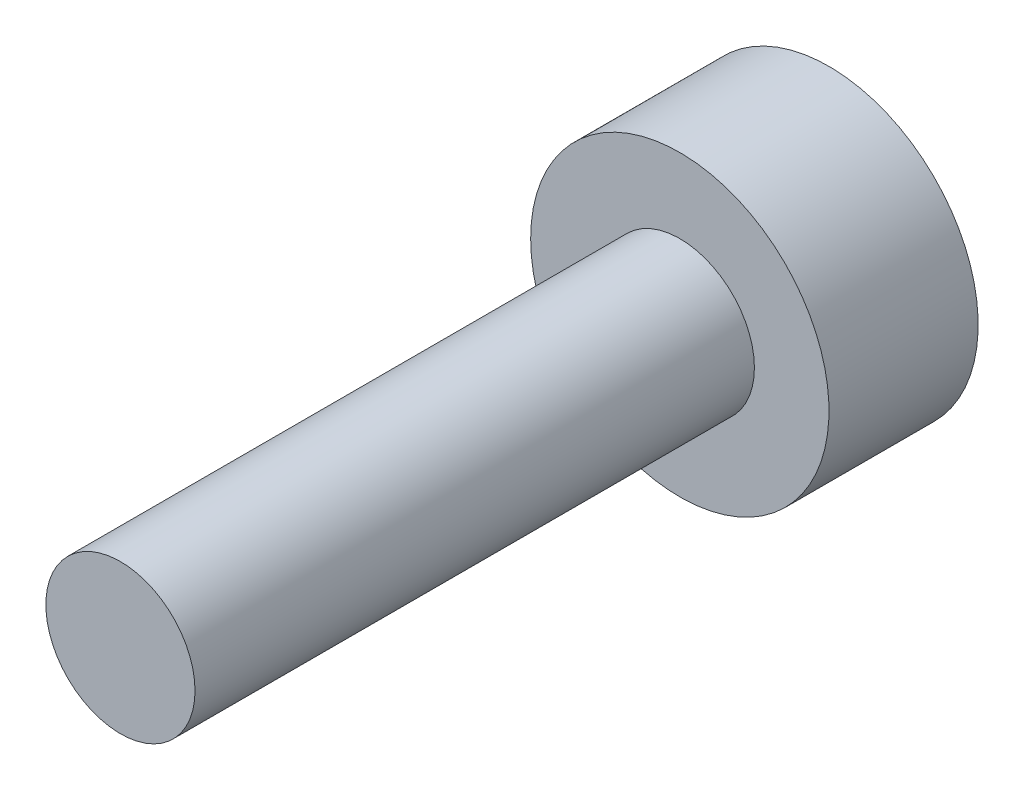
ISO-10303-21;
HEADER;
FILE_DESCRIPTION(('STEP AP214'),'2;1');
FILE_NAME('part.step','',(''),(''),'','','');
FILE_SCHEMA(('AUTOMOTIVE_DESIGN { 1 0 10303 214 1 1 1 1 }'));
ENDSEC;
DATA;
#1=APPLICATION_CONTEXT('core data for automotive mechanical design processes');
#2=APPLICATION_PROTOCOL_DEFINITION('international standard','automotive_design',2000,#1);
#3=PRODUCT_CONTEXT('',#1,'mechanical');
#4=PRODUCT('Part','Part','',(#3));
#5=PRODUCT_RELATED_PRODUCT_CATEGORY('part','',(#4));
#6=PRODUCT_DEFINITION_FORMATION('','',#4);
#7=PRODUCT_DEFINITION_CONTEXT('part definition',#1,'design');
#8=PRODUCT_DEFINITION('design','',#6,#7);
#9=PRODUCT_DEFINITION_SHAPE('','',#8);
#10=(LENGTH_UNIT() NAMED_UNIT(*) SI_UNIT(.MILLI.,.METRE.));
#11=(NAMED_UNIT(*) PLANE_ANGLE_UNIT() SI_UNIT($,.RADIAN.));
#12=(NAMED_UNIT(*) SI_UNIT($,.STERADIAN.) SOLID_ANGLE_UNIT());
#13=UNCERTAINTY_MEASURE_WITH_UNIT(LENGTH_MEASURE(1.E-05),#10,'distance_accuracy_value','');
#14=(GEOMETRIC_REPRESENTATION_CONTEXT(3) GLOBAL_UNCERTAINTY_ASSIGNED_CONTEXT((#13)) GLOBAL_UNIT_ASSIGNED_CONTEXT((#10,
#11,#12)) REPRESENTATION_CONTEXT('',''));
#15=CARTESIAN_POINT('',(0.,0.,0.));
#16=DIRECTION('',(0.,0.,1.));
#17=DIRECTION('',(1.,0.,0.));
#18=AXIS2_PLACEMENT_3D('',#15,#16,#17);
#19=CARTESIAN_POINT('',(0.,0.,6.));
#20=DIRECTION('',(0.,0.,-1.));
#21=DIRECTION('',(-1.,0.,0.));
#22=AXIS2_PLACEMENT_3D('',#19,#20,#21);
#23=CYLINDRICAL_SURFACE('',#22,0.799999999999999);
#24=CARTESIAN_POINT('',(0.,0.,6.));
#25=DIRECTION('',(0.,0.,1.));
#26=DIRECTION('',(1.,0.,0.));
#27=AXIS2_PLACEMENT_3D('',#24,#25,#26);
#28=CIRCLE('',#27,0.799999999999999);
#29=CARTESIAN_POINT('',(0.799999999999999,0.,6.));
#30=VERTEX_POINT('',#29);
#31=EDGE_CURVE('E11',#30,#30,#28,.T.);
#32=ORIENTED_EDGE('',*,*,#31,.F.);
#33=EDGE_LOOP('',(#32));
#34=FACE_BOUND('',#33,.T.);
#35=CARTESIAN_POINT('',(0.,0.,0.));
#36=DIRECTION('',(0.,0.,1.));
#37=DIRECTION('',(1.,0.,0.));
#38=AXIS2_PLACEMENT_3D('',#35,#36,#37);
#39=CIRCLE('',#38,0.799999999999999);
#40=CARTESIAN_POINT('',(0.799999999999999,0.,0.));
#41=VERTEX_POINT('',#40);
#42=EDGE_CURVE('E35',#41,#41,#39,.T.);
#43=ORIENTED_EDGE('',*,*,#42,.T.);
#44=EDGE_LOOP('',(#43));
#45=FACE_BOUND('',#44,.T.);
#46=ADVANCED_FACE('F32',(#34,#45),#23,.T.);
#47=CARTESIAN_POINT('',(0.,0.,6.));
#48=DIRECTION('',(0.,0.,1.));
#49=DIRECTION('',(1.,0.,0.));
#50=AXIS2_PLACEMENT_3D('',#47,#48,#49);
#51=PLANE('',#50);
#52=ORIENTED_EDGE('',*,*,#31,.T.);
#53=EDGE_LOOP('',(#52));
#54=FACE_BOUND('',#53,.T.);
#55=ADVANCED_FACE('F164',(#54),#51,.T.);
#56=CARTESIAN_POINT('',(0.,0.,-1.6));
#57=DIRECTION('',(0.,0.,1.));
#58=DIRECTION('',(1.,0.,0.));
#59=AXIS2_PLACEMENT_3D('',#56,#57,#58);
#60=CYLINDRICAL_SURFACE('',#59,1.6);
#61=CARTESIAN_POINT('',(0.,0.,-1.6));
#62=DIRECTION('',(0.,0.,-1.));
#63=DIRECTION('',(-1.,0.,0.));
#64=AXIS2_PLACEMENT_3D('',#61,#62,#63);
#65=CIRCLE('',#64,1.6);
#66=CARTESIAN_POINT('',(-1.6,0.,-1.6));
#67=VERTEX_POINT('',#66);
#68=EDGE_CURVE('E139',#67,#67,#65,.T.);
#69=ORIENTED_EDGE('',*,*,#68,.F.);
#70=EDGE_LOOP('',(#69));
#71=FACE_BOUND('',#70,.T.);
#72=CARTESIAN_POINT('',(0.,0.,0.));
#73=DIRECTION('',(0.,0.,-1.));
#74=DIRECTION('',(-1.,0.,0.));
#75=AXIS2_PLACEMENT_3D('',#72,#73,#74);
#76=CIRCLE('',#75,1.6);
#77=CARTESIAN_POINT('',(-1.6,0.,0.));
#78=VERTEX_POINT('',#77);
#79=EDGE_CURVE('E133',#78,#78,#76,.T.);
#80=ORIENTED_EDGE('',*,*,#79,.T.);
#81=EDGE_LOOP('',(#80));
#82=FACE_BOUND('',#81,.T.);
#83=ADVANCED_FACE('F145',(#71,#82),#60,.T.);
#84=CARTESIAN_POINT('',(0.,0.,-1.6));
#85=DIRECTION('',(0.,0.,-1.));
#86=DIRECTION('',(-1.,0.,0.));
#87=AXIS2_PLACEMENT_3D('',#84,#85,#86);
#88=PLANE('',#87);
#89=DIRECTION('',(-0.5,0.866025403784439,0.));
#90=VECTOR('',#89,1.);
#91=CARTESIAN_POINT('',(-0.4,-0.692820323027551,-1.6));
#92=LINE('',#91,#90);
#93=CARTESIAN_POINT('',(-0.4,-0.692820323027551,-1.6));
#94=VERTEX_POINT('',#93);
#95=CARTESIAN_POINT('',(-0.8,0.,-1.6));
#96=VERTEX_POINT('',#95);
#97=EDGE_CURVE('E46',#94,#96,#92,.T.);
#98=ORIENTED_EDGE('',*,*,#97,.F.);
#99=DIRECTION('',(-1.,0.,0.));
#100=VECTOR('',#99,1.);
#101=CARTESIAN_POINT('',(0.4,-0.692820323027551,-1.6));
#102=LINE('',#101,#100);
#103=CARTESIAN_POINT('',(0.4,-0.692820323027551,-1.6));
#104=VERTEX_POINT('',#103);
#105=EDGE_CURVE('E129',#104,#94,#102,.T.);
#106=ORIENTED_EDGE('',*,*,#105,.F.);
#107=DIRECTION('',(-0.5,-0.866025403784439,0.));
#108=VECTOR('',#107,1.);
#109=CARTESIAN_POINT('',(0.8,0.,-1.6));
#110=LINE('',#109,#108);
#111=CARTESIAN_POINT('',(0.8,0.,-1.6));
#112=VERTEX_POINT('',#111);
#113=EDGE_CURVE('E127',#112,#104,#110,.T.);
#114=ORIENTED_EDGE('',*,*,#113,.F.);
#115=DIRECTION('',(0.5,-0.866025403784439,0.));
#116=VECTOR('',#115,1.);
#117=CARTESIAN_POINT('',(0.4,0.692820323027551,-1.6));
#118=LINE('',#117,#116);
#119=CARTESIAN_POINT('',(0.4,0.692820323027551,-1.6));
#120=VERTEX_POINT('',#119);
#121=EDGE_CURVE('E94',#120,#112,#118,.T.);
#122=ORIENTED_EDGE('',*,*,#121,.F.);
#123=DIRECTION('',(1.,0.,0.));
#124=VECTOR('',#123,1.);
#125=CARTESIAN_POINT('',(-0.4,0.692820323027551,-1.6));
#126=LINE('',#125,#124);
#127=CARTESIAN_POINT('',(-0.4,0.692820323027551,-1.6));
#128=VERTEX_POINT('',#127);
#129=EDGE_CURVE('E123',#128,#120,#126,.T.);
#130=ORIENTED_EDGE('',*,*,#129,.F.);
#131=DIRECTION('',(0.5,0.866025403784439,0.));
#132=VECTOR('',#131,1.);
#133=CARTESIAN_POINT('',(-0.8,0.,-1.6));
#134=LINE('',#133,#132);
#135=EDGE_CURVE('E120',#96,#128,#134,.T.);
#136=ORIENTED_EDGE('',*,*,#135,.F.);
#137=EDGE_LOOP('',(#98,#106,#114,#122,#130,#136));
#138=FACE_BOUND('',#137,.T.);
#139=ORIENTED_EDGE('',*,*,#68,.T.);
#140=EDGE_LOOP('',(#139));
#141=FACE_BOUND('',#140,.T.);
#142=ADVANCED_FACE('F150',(#138,#141),#88,.T.);
#143=CARTESIAN_POINT('',(0.,0.,0.));
#144=DIRECTION('',(0.,0.,-1.));
#145=DIRECTION('',(-1.,0.,0.));
#146=AXIS2_PLACEMENT_3D('',#143,#144,#145);
#147=PLANE('',#146);
#148=ORIENTED_EDGE('',*,*,#42,.F.);
#149=EDGE_LOOP('',(#148));
#150=FACE_BOUND('',#149,.T.);
#151=ORIENTED_EDGE('',*,*,#79,.F.);
#152=EDGE_LOOP('',(#151));
#153=FACE_BOUND('',#152,.T.);
#154=ADVANCED_FACE('F147',(#150,#153),#147,.F.);
#155=CARTESIAN_POINT('',(-0.4,-0.692820323027551,-0.8));
#156=DIRECTION('',(-0.866025403784439,-0.5,0.));
#157=DIRECTION('',(0.5,-0.866025403784439,0.));
#158=AXIS2_PLACEMENT_3D('',#155,#156,#157);
#159=PLANE('',#158);
#160=ORIENTED_EDGE('',*,*,#97,.T.);
#161=DIRECTION('',(0.,0.,-1.));
#162=VECTOR('',#161,1.);
#163=CARTESIAN_POINT('',(-0.8,0.,-0.8));
#164=LINE('',#163,#162);
#165=CARTESIAN_POINT('',(-0.8,0.,-0.8));
#166=VERTEX_POINT('',#165);
#167=EDGE_CURVE('E76',#166,#96,#164,.T.);
#168=ORIENTED_EDGE('',*,*,#167,.F.);
#169=DIRECTION('',(-0.5,0.866025403784439,0.));
#170=VECTOR('',#169,1.);
#171=CARTESIAN_POINT('',(-0.4,-0.692820323027551,-0.8));
#172=LINE('',#171,#170);
#173=CARTESIAN_POINT('',(-0.4,-0.692820323027551,-0.8));
#174=VERTEX_POINT('',#173);
#175=EDGE_CURVE('E131',#174,#166,#172,.T.);
#176=ORIENTED_EDGE('',*,*,#175,.F.);
#177=DIRECTION('',(0.,0.,-1.));
#178=VECTOR('',#177,1.);
#179=CARTESIAN_POINT('',(-0.4,-0.692820323027551,-0.8));
#180=LINE('',#179,#178);
#181=EDGE_CURVE('E54',#174,#94,#180,.T.);
#182=ORIENTED_EDGE('',*,*,#181,.T.);
#183=EDGE_LOOP('',(#160,#168,#176,#182));
#184=FACE_BOUND('',#183,.T.);
#185=ADVANCED_FACE('F149',(#184),#159,.F.);
#186=CARTESIAN_POINT('',(0.4,-0.692820323027551,-0.8));
#187=DIRECTION('',(0.,-1.,0.));
#188=DIRECTION('',(0.,0.,-1.));
#189=AXIS2_PLACEMENT_3D('',#186,#187,#188);
#190=PLANE('',#189);
#191=ORIENTED_EDGE('',*,*,#105,.T.);
#192=ORIENTED_EDGE('',*,*,#181,.F.);
#193=DIRECTION('',(-1.,0.,0.));
#194=VECTOR('',#193,1.);
#195=CARTESIAN_POINT('',(0.4,-0.692820323027551,-0.8));
#196=LINE('',#195,#194);
#197=CARTESIAN_POINT('',(0.4,-0.692820323027551,-0.8));
#198=VERTEX_POINT('',#197);
#199=EDGE_CURVE('E106',#198,#174,#196,.T.);
#200=ORIENTED_EDGE('',*,*,#199,.F.);
#201=DIRECTION('',(0.,0.,-1.));
#202=VECTOR('',#201,1.);
#203=CARTESIAN_POINT('',(0.4,-0.692820323027551,-0.8));
#204=LINE('',#203,#202);
#205=EDGE_CURVE('E98',#198,#104,#204,.T.);
#206=ORIENTED_EDGE('',*,*,#205,.T.);
#207=EDGE_LOOP('',(#191,#192,#200,#206));
#208=FACE_BOUND('',#207,.T.);
#209=ADVANCED_FACE('F157',(#208),#190,.F.);
#210=CARTESIAN_POINT('',(0.8,0.,-0.8));
#211=DIRECTION('',(0.866025403784439,-0.5,0.));
#212=DIRECTION('',(0.5,0.866025403784439,0.));
#213=AXIS2_PLACEMENT_3D('',#210,#211,#212);
#214=PLANE('',#213);
#215=ORIENTED_EDGE('',*,*,#113,.T.);
#216=ORIENTED_EDGE('',*,*,#205,.F.);
#217=DIRECTION('',(-0.5,-0.866025403784439,0.));
#218=VECTOR('',#217,1.);
#219=CARTESIAN_POINT('',(0.8,0.,-0.8));
#220=LINE('',#219,#218);
#221=CARTESIAN_POINT('',(0.8,0.,-0.8));
#222=VERTEX_POINT('',#221);
#223=EDGE_CURVE('E102',#222,#198,#220,.T.);
#224=ORIENTED_EDGE('',*,*,#223,.F.);
#225=DIRECTION('',(0.,0.,-1.));
#226=VECTOR('',#225,1.);
#227=CARTESIAN_POINT('',(0.8,0.,-0.8));
#228=LINE('',#227,#226);
#229=EDGE_CURVE('E87',#222,#112,#228,.T.);
#230=ORIENTED_EDGE('',*,*,#229,.T.);
#231=EDGE_LOOP('',(#215,#216,#224,#230));
#232=FACE_BOUND('',#231,.T.);
#233=ADVANCED_FACE('F103',(#232),#214,.F.);
#234=CARTESIAN_POINT('',(0.4,0.692820323027551,-0.8));
#235=DIRECTION('',(0.866025403784439,0.5,0.));
#236=DIRECTION('',(-0.5,0.866025403784439,0.));
#237=AXIS2_PLACEMENT_3D('',#234,#235,#236);
#238=PLANE('',#237);
#239=ORIENTED_EDGE('',*,*,#121,.T.);
#240=ORIENTED_EDGE('',*,*,#229,.F.);
#241=DIRECTION('',(0.5,-0.866025403784439,0.));
#242=VECTOR('',#241,1.);
#243=CARTESIAN_POINT('',(0.4,0.692820323027551,-0.8));
#244=LINE('',#243,#242);
#245=CARTESIAN_POINT('',(0.4,0.692820323027551,-0.8));
#246=VERTEX_POINT('',#245);
#247=EDGE_CURVE('E91',#246,#222,#244,.T.);
#248=ORIENTED_EDGE('',*,*,#247,.F.);
#249=DIRECTION('',(0.,0.,-1.));
#250=VECTOR('',#249,1.);
#251=CARTESIAN_POINT('',(0.4,0.692820323027551,-0.8));
#252=LINE('',#251,#250);
#253=EDGE_CURVE('E99',#246,#120,#252,.T.);
#254=ORIENTED_EDGE('',*,*,#253,.T.);
#255=EDGE_LOOP('',(#239,#240,#248,#254));
#256=FACE_BOUND('',#255,.T.);
#257=ADVANCED_FACE('F89',(#256),#238,.F.);
#258=CARTESIAN_POINT('',(-0.4,0.692820323027551,-0.8));
#259=DIRECTION('',(0.,1.,0.));
#260=DIRECTION('',(-1.,0.,0.));
#261=AXIS2_PLACEMENT_3D('',#258,#259,#260);
#262=PLANE('',#261);
#263=ORIENTED_EDGE('',*,*,#129,.T.);
#264=ORIENTED_EDGE('',*,*,#253,.F.);
#265=DIRECTION('',(1.,0.,0.));
#266=VECTOR('',#265,1.);
#267=CARTESIAN_POINT('',(-0.4,0.692820323027551,-0.8));
#268=LINE('',#267,#266);
#269=CARTESIAN_POINT('',(-0.4,0.692820323027551,-0.8));
#270=VERTEX_POINT('',#269);
#271=EDGE_CURVE('E112',#270,#246,#268,.T.);
#272=ORIENTED_EDGE('',*,*,#271,.F.);
#273=DIRECTION('',(0.,0.,-1.));
#274=VECTOR('',#273,1.);
#275=CARTESIAN_POINT('',(-0.4,0.692820323027551,-0.8));
#276=LINE('',#275,#274);
#277=EDGE_CURVE('E136',#270,#128,#276,.T.);
#278=ORIENTED_EDGE('',*,*,#277,.T.);
#279=EDGE_LOOP('',(#263,#264,#272,#278));
#280=FACE_BOUND('',#279,.T.);
#281=ADVANCED_FACE('F218',(#280),#262,.F.);
#282=CARTESIAN_POINT('',(-0.8,0.,-0.8));
#283=DIRECTION('',(-0.866025403784439,0.5,0.));
#284=DIRECTION('',(-0.5,-0.866025403784439,0.));
#285=AXIS2_PLACEMENT_3D('',#282,#283,#284);
#286=PLANE('',#285);
#287=ORIENTED_EDGE('',*,*,#135,.T.);
#288=ORIENTED_EDGE('',*,*,#277,.F.);
#289=DIRECTION('',(0.5,0.866025403784439,0.));
#290=VECTOR('',#289,1.);
#291=CARTESIAN_POINT('',(-0.8,0.,-0.8));
#292=LINE('',#291,#290);
#293=EDGE_CURVE('E114',#166,#270,#292,.T.);
#294=ORIENTED_EDGE('',*,*,#293,.F.);
#295=ORIENTED_EDGE('',*,*,#167,.T.);
#296=EDGE_LOOP('',(#287,#288,#294,#295));
#297=FACE_BOUND('',#296,.T.);
#298=ADVANCED_FACE('F227',(#297),#286,.F.);
#299=CARTESIAN_POINT('',(0.,0.,-0.8));
#300=DIRECTION('',(0.,0.,-1.));
#301=DIRECTION('',(-1.,0.,0.));
#302=AXIS2_PLACEMENT_3D('',#299,#300,#301);
#303=PLANE('',#302);
#304=ORIENTED_EDGE('',*,*,#175,.T.);
#305=ORIENTED_EDGE('',*,*,#293,.T.);
#306=ORIENTED_EDGE('',*,*,#271,.T.);
#307=ORIENTED_EDGE('',*,*,#247,.T.);
#308=ORIENTED_EDGE('',*,*,#223,.T.);
#309=ORIENTED_EDGE('',*,*,#199,.T.);
#310=EDGE_LOOP('',(#304,#305,#306,#307,#308,#309));
#311=FACE_BOUND('',#310,.T.);
#312=ADVANCED_FACE('F109',(#311),#303,.T.);
#313=CLOSED_SHELL('',(#46,#55,#83,#142,#154,#185,#209,#233,#257,#281,#298,#312));
#314=MANIFOLD_SOLID_BREP('B2',#313);
#315=ADVANCED_BREP_SHAPE_REPRESENTATION('',(#18,#314),#14);
#316=SHAPE_DEFINITION_REPRESENTATION(#9,#315);
ENDSEC;
END-ISO-10303-21;
